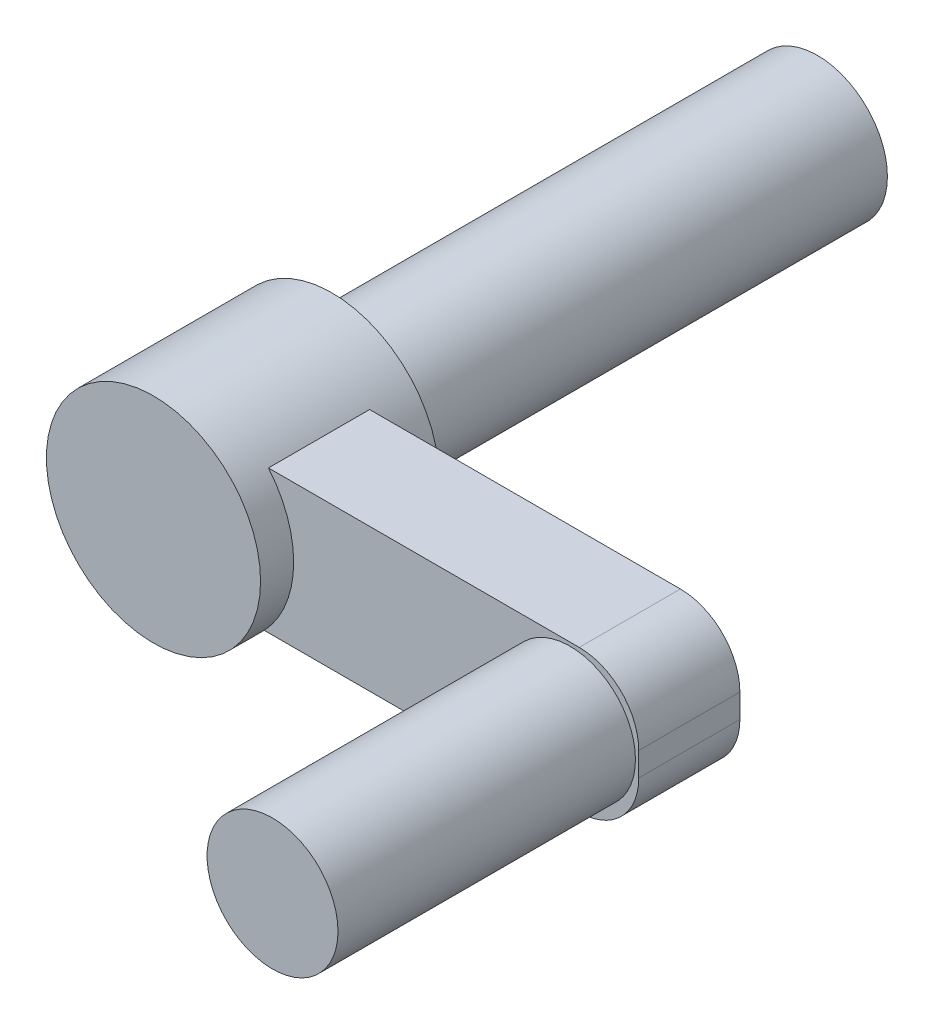
ISO-10303-21;
HEADER;
FILE_DESCRIPTION(('STEP AP214'),'2;1');
FILE_NAME('part.step','',(''),(''),'','','');
FILE_SCHEMA(('AUTOMOTIVE_DESIGN { 1 0 10303 214 1 1 1 1 }'));
ENDSEC;
DATA;
#1=APPLICATION_CONTEXT('core data for automotive mechanical design processes');
#2=APPLICATION_PROTOCOL_DEFINITION('international standard','automotive_design',2000,#1);
#3=PRODUCT_CONTEXT('',#1,'mechanical');
#4=PRODUCT('Part','Part','',(#3));
#5=PRODUCT_RELATED_PRODUCT_CATEGORY('part','',(#4));
#6=PRODUCT_DEFINITION_FORMATION('','',#4);
#7=PRODUCT_DEFINITION_CONTEXT('part definition',#1,'design');
#8=PRODUCT_DEFINITION('design','',#6,#7);
#9=PRODUCT_DEFINITION_SHAPE('','',#8);
#10=(LENGTH_UNIT() NAMED_UNIT(*) SI_UNIT(.MILLI.,.METRE.));
#11=(NAMED_UNIT(*) PLANE_ANGLE_UNIT() SI_UNIT($,.RADIAN.));
#12=(NAMED_UNIT(*) SI_UNIT($,.STERADIAN.) SOLID_ANGLE_UNIT());
#13=UNCERTAINTY_MEASURE_WITH_UNIT(LENGTH_MEASURE(1.E-05),#10,'distance_accuracy_value','');
#14=(GEOMETRIC_REPRESENTATION_CONTEXT(3) GLOBAL_UNCERTAINTY_ASSIGNED_CONTEXT((#13)) GLOBAL_UNIT_ASSIGNED_CONTEXT((#10,
#11,#12)) REPRESENTATION_CONTEXT('',''));
#15=CARTESIAN_POINT('',(0.,0.,0.));
#16=DIRECTION('',(0.,0.,1.));
#17=DIRECTION('',(1.,0.,0.));
#18=AXIS2_PLACEMENT_3D('',#15,#16,#17);
#19=CARTESIAN_POINT('',(33.,-1.1976283958276,53.0178686877295));
#20=DIRECTION('',(0.,0.,1.));
#21=DIRECTION('',(0.,-1.,0.));
#22=AXIS2_PLACEMENT_3D('',#19,#20,#21);
#23=CYLINDRICAL_SURFACE('',#22,5.);
#24=DIRECTION('',(0.,0.,1.));
#25=VECTOR('',#24,1.);
#26=CARTESIAN_POINT('',(33.,-6.1976283958276,53.0178686877295));
#27=LINE('',#26,#25);
#28=CARTESIAN_POINT('',(33.,-6.1976283958276,44.5178686877295));
#29=VERTEX_POINT('',#28);
#30=CARTESIAN_POINT('',(33.,-6.1976283958276,53.0178686877295));
#31=VERTEX_POINT('',#30);
#32=EDGE_CURVE('E123',#29,#31,#27,.T.);
#33=ORIENTED_EDGE('',*,*,#32,.F.);
#34=CARTESIAN_POINT('',(33.,-1.1976283958276,44.5178686877295));
#35=DIRECTION('',(0.,0.,1.));
#36=DIRECTION('',(1.,0.,0.));
#37=AXIS2_PLACEMENT_3D('',#34,#35,#36);
#38=CIRCLE('',#37,5.);
#39=CARTESIAN_POINT('',(38.,-1.1976283958276,44.5178686877295));
#40=VERTEX_POINT('',#39);
#41=EDGE_CURVE('E41',#40,#29,#38,.F.);
#42=ORIENTED_EDGE('',*,*,#41,.F.);
#43=DIRECTION('',(0.,0.,1.));
#44=VECTOR('',#43,1.);
#45=CARTESIAN_POINT('',(38.,-1.1976283958276,0.));
#46=LINE('',#45,#44);
#47=CARTESIAN_POINT('',(38.,-1.1976283958276,53.0178686877295));
#48=VERTEX_POINT('',#47);
#49=EDGE_CURVE('E126',#48,#40,#46,.F.);
#50=ORIENTED_EDGE('',*,*,#49,.F.);
#51=CARTESIAN_POINT('',(33.,-1.1976283958276,53.0178686877295));
#52=DIRECTION('',(0.,0.,1.));
#53=DIRECTION('',(1.,0.,0.));
#54=AXIS2_PLACEMENT_3D('',#51,#52,#53);
#55=CIRCLE('',#54,5.);
#56=EDGE_CURVE('E11',#31,#48,#55,.T.);
#57=ORIENTED_EDGE('',*,*,#56,.F.);
#58=EDGE_LOOP('',(#33,#42,#50,#57));
#59=FACE_BOUND('',#58,.T.);
#60=ADVANCED_FACE('F34',(#59),#23,.T.);
#61=CARTESIAN_POINT('',(33.,0.802371604172398,0.));
#62=DIRECTION('',(0.,0.,-1.));
#63=DIRECTION('',(-1.,0.,0.));
#64=AXIS2_PLACEMENT_3D('',#61,#62,#63);
#65=CYLINDRICAL_SURFACE('',#64,5.);
#66=DIRECTION('',(0.,0.,1.));
#67=VECTOR('',#66,1.);
#68=CARTESIAN_POINT('',(38.,0.802371604172398,0.));
#69=LINE('',#68,#67);
#70=CARTESIAN_POINT('',(38.,0.802371604172398,44.5178686877295));
#71=VERTEX_POINT('',#70);
#72=CARTESIAN_POINT('',(38.,0.802371604172398,53.0178686877295));
#73=VERTEX_POINT('',#72);
#74=EDGE_CURVE('E110',#71,#73,#69,.T.);
#75=ORIENTED_EDGE('',*,*,#74,.F.);
#76=CARTESIAN_POINT('',(33.,0.802371604172398,44.5178686877295));
#77=DIRECTION('',(0.,0.,1.));
#78=DIRECTION('',(1.,0.,0.));
#79=AXIS2_PLACEMENT_3D('',#76,#77,#78);
#80=CIRCLE('',#79,5.);
#81=CARTESIAN_POINT('',(33.,5.8023716041724,44.5178686877295));
#82=VERTEX_POINT('',#81);
#83=EDGE_CURVE('E119',#82,#71,#80,.F.);
#84=ORIENTED_EDGE('',*,*,#83,.F.);
#85=DIRECTION('',(0.,0.,1.));
#86=VECTOR('',#85,1.);
#87=CARTESIAN_POINT('',(33.,5.8023716041724,0.));
#88=LINE('',#87,#86);
#89=CARTESIAN_POINT('',(33.,5.8023716041724,53.0178686877295));
#90=VERTEX_POINT('',#89);
#91=EDGE_CURVE('E113',#90,#82,#88,.F.);
#92=ORIENTED_EDGE('',*,*,#91,.F.);
#93=CARTESIAN_POINT('',(33.,0.802371604172398,53.0178686877295));
#94=DIRECTION('',(0.,0.,1.));
#95=DIRECTION('',(1.,0.,0.));
#96=AXIS2_PLACEMENT_3D('',#93,#94,#95);
#97=CIRCLE('',#96,5.);
#98=EDGE_CURVE('E89',#73,#90,#97,.T.);
#99=ORIENTED_EDGE('',*,*,#98,.F.);
#100=EDGE_LOOP('',(#75,#84,#92,#99));
#101=FACE_BOUND('',#100,.T.);
#102=ADVANCED_FACE('F158',(#101),#65,.T.);
#103=CARTESIAN_POINT('',(0.,0.,40.8));
#104=DIRECTION('',(0.,0.,-1.));
#105=DIRECTION('',(-1.,0.,0.));
#106=AXIS2_PLACEMENT_3D('',#103,#104,#105);
#107=CYLINDRICAL_SURFACE('',#106,5.88);
#108=CARTESIAN_POINT('',(0.,0.,40.8));
#109=DIRECTION('',(0.,0.,1.));
#110=DIRECTION('',(1.,0.,0.));
#111=AXIS2_PLACEMENT_3D('',#108,#109,#110);
#112=CIRCLE('',#111,5.88);
#113=CARTESIAN_POINT('',(5.88,0.,40.8));
#114=VERTEX_POINT('',#113);
#115=EDGE_CURVE('E104',#114,#114,#112,.T.);
#116=ORIENTED_EDGE('',*,*,#115,.F.);
#117=EDGE_LOOP('',(#116));
#118=FACE_BOUND('',#117,.T.);
#119=CARTESIAN_POINT('',(0.,0.,0.));
#120=DIRECTION('',(0.,0.,1.));
#121=DIRECTION('',(1.,0.,0.));
#122=AXIS2_PLACEMENT_3D('',#119,#120,#121);
#123=CIRCLE('',#122,5.88);
#124=CARTESIAN_POINT('',(5.88,0.,0.));
#125=VERTEX_POINT('',#124);
#126=EDGE_CURVE('E150',#125,#125,#123,.T.);
#127=ORIENTED_EDGE('',*,*,#126,.T.);
#128=EDGE_LOOP('',(#127));
#129=FACE_BOUND('',#128,.T.);
#130=ADVANCED_FACE('F193',(#118,#129),#107,.T.);
#131=CARTESIAN_POINT('',(0.,0.,0.));
#132=DIRECTION('',(0.,0.,1.));
#133=DIRECTION('',(1.,0.,0.));
#134=AXIS2_PLACEMENT_3D('',#131,#132,#133);
#135=PLANE('',#134);
#136=CARTESIAN_POINT('',(0.,0.,0.));
#137=DIRECTION('',(0.,0.,-1.));
#138=DIRECTION('',(-1.,0.,0.));
#139=AXIS2_PLACEMENT_3D('',#136,#137,#138);
#140=CIRCLE('',#139,5.);
#141=CARTESIAN_POINT('',(-5.,0.,0.));
#142=VERTEX_POINT('',#141);
#143=EDGE_CURVE('E136',#142,#142,#140,.T.);
#144=ORIENTED_EDGE('',*,*,#143,.F.);
#145=EDGE_LOOP('',(#144));
#146=FACE_BOUND('',#145,.T.);
#147=ORIENTED_EDGE('',*,*,#126,.F.);
#148=EDGE_LOOP('',(#147));
#149=FACE_BOUND('',#148,.T.);
#150=ADVANCED_FACE('F197',(#146,#149),#135,.F.);
#151=CARTESIAN_POINT('',(0.,0.,55.8));
#152=DIRECTION('',(0.,0.,-1.));
#153=DIRECTION('',(-1.,0.,0.));
#154=AXIS2_PLACEMENT_3D('',#151,#152,#153);
#155=CYLINDRICAL_SURFACE('',#154,9.);
#156=DIRECTION('',(0.,0.,-1.));
#157=VECTOR('',#156,1.);
#158=CARTESIAN_POINT('',(6.52605564389635,-6.1976283958276,55.8));
#159=LINE('',#158,#157);
#160=CARTESIAN_POINT('',(6.52605564389635,-6.1976283958276,53.0178686877295));
#161=VERTEX_POINT('',#160);
#162=CARTESIAN_POINT('',(6.52605564389635,-6.1976283958276,44.5178686877295));
#163=VERTEX_POINT('',#162);
#164=EDGE_CURVE('E109',#161,#163,#159,.T.);
#165=ORIENTED_EDGE('',*,*,#164,.F.);
#166=CARTESIAN_POINT('',(0.,0.,53.0178686877295));
#167=DIRECTION('',(0.,0.,1.));
#168=DIRECTION('',(1.,0.,0.));
#169=AXIS2_PLACEMENT_3D('',#166,#167,#168);
#170=CIRCLE('',#169,9.);
#171=CARTESIAN_POINT('',(6.87986073747818,5.8023716041724,53.0178686877295));
#172=VERTEX_POINT('',#171);
#173=EDGE_CURVE('E86',#161,#172,#170,.T.);
#174=ORIENTED_EDGE('',*,*,#173,.T.);
#175=DIRECTION('',(0.,0.,-1.));
#176=VECTOR('',#175,1.);
#177=CARTESIAN_POINT('',(6.87986073747818,5.8023716041724,55.8));
#178=LINE('',#177,#176);
#179=CARTESIAN_POINT('',(6.87986073747818,5.8023716041724,44.5178686877295));
#180=VERTEX_POINT('',#179);
#181=EDGE_CURVE('E97',#172,#180,#178,.T.);
#182=ORIENTED_EDGE('',*,*,#181,.T.);
#183=CARTESIAN_POINT('',(0.,0.,44.5178686877295));
#184=DIRECTION('',(0.,0.,1.));
#185=DIRECTION('',(1.,0.,0.));
#186=AXIS2_PLACEMENT_3D('',#183,#184,#185);
#187=CIRCLE('',#186,9.);
#188=EDGE_CURVE('E103',#163,#180,#187,.T.);
#189=ORIENTED_EDGE('',*,*,#188,.F.);
#190=EDGE_LOOP('',(#165,#174,#182,#189));
#191=FACE_BOUND('',#190,.T.);
#192=CARTESIAN_POINT('',(0.,0.,55.8));
#193=DIRECTION('',(0.,0.,1.));
#194=DIRECTION('',(1.,0.,0.));
#195=AXIS2_PLACEMENT_3D('',#192,#193,#194);
#196=CIRCLE('',#195,9.);
#197=CARTESIAN_POINT('',(9.,0.,55.8));
#198=VERTEX_POINT('',#197);
#199=EDGE_CURVE('E147',#198,#198,#196,.T.);
#200=ORIENTED_EDGE('',*,*,#199,.F.);
#201=EDGE_LOOP('',(#200));
#202=FACE_BOUND('',#201,.T.);
#203=CARTESIAN_POINT('',(0.,0.,40.8));
#204=DIRECTION('',(0.,0.,1.));
#205=DIRECTION('',(1.,0.,0.));
#206=AXIS2_PLACEMENT_3D('',#203,#204,#205);
#207=CIRCLE('',#206,9.);
#208=CARTESIAN_POINT('',(9.,0.,40.8));
#209=VERTEX_POINT('',#208);
#210=EDGE_CURVE('E144',#209,#209,#207,.T.);
#211=ORIENTED_EDGE('',*,*,#210,.T.);
#212=EDGE_LOOP('',(#211));
#213=FACE_BOUND('',#212,.T.);
#214=ADVANCED_FACE('F106',(#191,#202,#213),#155,.T.);
#215=CARTESIAN_POINT('',(0.,0.,55.8));
#216=DIRECTION('',(0.,0.,1.));
#217=DIRECTION('',(1.,0.,0.));
#218=AXIS2_PLACEMENT_3D('',#215,#216,#217);
#219=PLANE('',#218);
#220=ORIENTED_EDGE('',*,*,#199,.T.);
#221=EDGE_LOOP('',(#220));
#222=FACE_BOUND('',#221,.T.);
#223=ADVANCED_FACE('F206',(#222),#219,.T.);
#224=CARTESIAN_POINT('',(0.,0.,40.8));
#225=DIRECTION('',(0.,0.,1.));
#226=DIRECTION('',(1.,0.,0.));
#227=AXIS2_PLACEMENT_3D('',#224,#225,#226);
#228=PLANE('',#227);
#229=ORIENTED_EDGE('',*,*,#115,.T.);
#230=EDGE_LOOP('',(#229));
#231=FACE_BOUND('',#230,.T.);
#232=ORIENTED_EDGE('',*,*,#210,.F.);
#233=EDGE_LOOP('',(#232));
#234=FACE_BOUND('',#233,.T.);
#235=ADVANCED_FACE('F207',(#231,#234),#228,.F.);
#236=CARTESIAN_POINT('',(0.,0.,40.));
#237=DIRECTION('',(0.,0.,-1.));
#238=DIRECTION('',(-1.,0.,0.));
#239=AXIS2_PLACEMENT_3D('',#236,#237,#238);
#240=CYLINDRICAL_SURFACE('',#239,5.);
#241=CARTESIAN_POINT('',(0.,0.,40.));
#242=DIRECTION('',(0.,0.,-1.));
#243=DIRECTION('',(-1.,0.,0.));
#244=AXIS2_PLACEMENT_3D('',#241,#242,#243);
#245=CIRCLE('',#244,5.);
#246=CARTESIAN_POINT('',(-5.,0.,40.));
#247=VERTEX_POINT('',#246);
#248=EDGE_CURVE('E141',#247,#247,#245,.T.);
#249=ORIENTED_EDGE('',*,*,#248,.F.);
#250=EDGE_LOOP('',(#249));
#251=FACE_BOUND('',#250,.T.);
#252=ORIENTED_EDGE('',*,*,#143,.T.);
#253=EDGE_LOOP('',(#252));
#254=FACE_BOUND('',#253,.T.);
#255=ADVANCED_FACE('F210',(#251,#254),#240,.F.);
#256=CARTESIAN_POINT('',(0.,0.,40.));
#257=DIRECTION('',(0.,0.,-1.));
#258=DIRECTION('',(-1.,0.,0.));
#259=AXIS2_PLACEMENT_3D('',#256,#257,#258);
#260=PLANE('',#259);
#261=ORIENTED_EDGE('',*,*,#248,.T.);
#262=EDGE_LOOP('',(#261));
#263=FACE_BOUND('',#262,.T.);
#264=ADVANCED_FACE('F216',(#263),#260,.T.);
#265=CARTESIAN_POINT('',(38.,-6.1976283958276,53.0178686877295));
#266=DIRECTION('',(0.,1.,0.));
#267=DIRECTION('',(0.,0.,1.));
#268=AXIS2_PLACEMENT_3D('',#265,#266,#267);
#269=PLANE('',#268);
#270=DIRECTION('',(-1.,0.,0.));
#271=VECTOR('',#270,1.);
#272=CARTESIAN_POINT('',(38.,-6.1976283958276,44.5178686877295));
#273=LINE('',#272,#271);
#274=EDGE_CURVE('E131',#29,#163,#273,.T.);
#275=ORIENTED_EDGE('',*,*,#274,.F.);
#276=ORIENTED_EDGE('',*,*,#32,.T.);
#277=DIRECTION('',(-1.,0.,0.));
#278=VECTOR('',#277,1.);
#279=CARTESIAN_POINT('',(38.,-6.1976283958276,53.0178686877295));
#280=LINE('',#279,#278);
#281=EDGE_CURVE('E134',#31,#161,#280,.T.);
#282=ORIENTED_EDGE('',*,*,#281,.T.);
#283=ORIENTED_EDGE('',*,*,#164,.T.);
#284=EDGE_LOOP('',(#275,#276,#282,#283));
#285=FACE_BOUND('',#284,.T.);
#286=ADVANCED_FACE('F133',(#285),#269,.F.);
#287=CARTESIAN_POINT('',(38.,5.8023716041724,53.0178686877295));
#288=DIRECTION('',(0.,1.,0.));
#289=DIRECTION('',(0.,0.,1.));
#290=AXIS2_PLACEMENT_3D('',#287,#288,#289);
#291=PLANE('',#290);
#292=DIRECTION('',(-1.,0.,0.));
#293=VECTOR('',#292,1.);
#294=CARTESIAN_POINT('',(38.,5.8023716041724,53.0178686877295));
#295=LINE('',#294,#293);
#296=EDGE_CURVE('E82',#90,#172,#295,.T.);
#297=ORIENTED_EDGE('',*,*,#296,.F.);
#298=ORIENTED_EDGE('',*,*,#91,.T.);
#299=DIRECTION('',(-1.,0.,0.));
#300=VECTOR('',#299,1.);
#301=CARTESIAN_POINT('',(38.,5.8023716041724,44.5178686877295));
#302=LINE('',#301,#300);
#303=EDGE_CURVE('E93',#82,#180,#302,.T.);
#304=ORIENTED_EDGE('',*,*,#303,.T.);
#305=ORIENTED_EDGE('',*,*,#181,.F.);
#306=EDGE_LOOP('',(#297,#298,#304,#305));
#307=FACE_BOUND('',#306,.T.);
#308=ADVANCED_FACE('F98',(#307),#291,.T.);
#309=CARTESIAN_POINT('',(38.,-6.1976283958276,53.0178686877295));
#310=DIRECTION('',(0.,0.,1.));
#311=DIRECTION('',(1.,0.,0.));
#312=AXIS2_PLACEMENT_3D('',#309,#310,#311);
#313=PLANE('',#312);
#314=CARTESIAN_POINT('',(32.2226849826279,0.,53.0178686877295));
#315=DIRECTION('',(0.,0.,1.));
#316=DIRECTION('',(1.,0.,0.));
#317=AXIS2_PLACEMENT_3D('',#314,#315,#316);
#318=CIRCLE('',#317,5.5);
#319=CARTESIAN_POINT('',(37.7226849826279,0.,53.0178686877295));
#320=VERTEX_POINT('',#319);
#321=EDGE_CURVE('E166',#320,#320,#318,.T.);
#322=ORIENTED_EDGE('',*,*,#321,.F.);
#323=EDGE_LOOP('',(#322));
#324=FACE_BOUND('',#323,.T.);
#325=ORIENTED_EDGE('',*,*,#281,.F.);
#326=ORIENTED_EDGE('',*,*,#56,.T.);
#327=DIRECTION('',(0.,1.,0.));
#328=VECTOR('',#327,1.);
#329=CARTESIAN_POINT('',(38.,-6.1976283958276,53.0178686877295));
#330=LINE('',#329,#328);
#331=EDGE_CURVE('E162',#48,#73,#330,.T.);
#332=ORIENTED_EDGE('',*,*,#331,.T.);
#333=ORIENTED_EDGE('',*,*,#98,.T.);
#334=ORIENTED_EDGE('',*,*,#296,.T.);
#335=ORIENTED_EDGE('',*,*,#173,.F.);
#336=EDGE_LOOP('',(#325,#326,#332,#333,#334,#335));
#337=FACE_BOUND('',#336,.T.);
#338=ADVANCED_FACE('F84',(#324,#337),#313,.T.);
#339=CARTESIAN_POINT('',(38.,-6.1976283958276,44.5178686877295));
#340=DIRECTION('',(0.,0.,1.));
#341=DIRECTION('',(1.,0.,0.));
#342=AXIS2_PLACEMENT_3D('',#339,#340,#341);
#343=PLANE('',#342);
#344=DIRECTION('',(0.,1.,0.));
#345=VECTOR('',#344,1.);
#346=CARTESIAN_POINT('',(38.,-6.1976283958276,44.5178686877295));
#347=LINE('',#346,#345);
#348=EDGE_CURVE('E94',#40,#71,#347,.T.);
#349=ORIENTED_EDGE('',*,*,#348,.F.);
#350=ORIENTED_EDGE('',*,*,#41,.T.);
#351=ORIENTED_EDGE('',*,*,#274,.T.);
#352=ORIENTED_EDGE('',*,*,#188,.T.);
#353=ORIENTED_EDGE('',*,*,#303,.F.);
#354=ORIENTED_EDGE('',*,*,#83,.T.);
#355=EDGE_LOOP('',(#349,#350,#351,#352,#353,#354));
#356=FACE_BOUND('',#355,.T.);
#357=ADVANCED_FACE('F129',(#356),#343,.F.);
#358=CARTESIAN_POINT('',(38.,0.,0.));
#359=DIRECTION('',(-1.,0.,0.));
#360=DIRECTION('',(0.,0.,1.));
#361=AXIS2_PLACEMENT_3D('',#358,#359,#360);
#362=PLANE('',#361);
#363=ORIENTED_EDGE('',*,*,#331,.F.);
#364=ORIENTED_EDGE('',*,*,#49,.T.);
#365=ORIENTED_EDGE('',*,*,#348,.T.);
#366=ORIENTED_EDGE('',*,*,#74,.T.);
#367=EDGE_LOOP('',(#363,#364,#365,#366));
#368=FACE_BOUND('',#367,.T.);
#369=ADVANCED_FACE('F161',(#368),#362,.F.);
#370=CARTESIAN_POINT('',(32.2226849826279,0.,78.0178686877296));
#371=DIRECTION('',(0.,0.,-1.));
#372=DIRECTION('',(-1.,0.,0.));
#373=AXIS2_PLACEMENT_3D('',#370,#371,#372);
#374=CYLINDRICAL_SURFACE('',#373,5.5);
#375=CARTESIAN_POINT('',(32.2226849826279,0.,78.0178686877296));
#376=DIRECTION('',(0.,0.,1.));
#377=DIRECTION('',(1.,0.,0.));
#378=AXIS2_PLACEMENT_3D('',#375,#376,#377);
#379=CIRCLE('',#378,5.5);
#380=CARTESIAN_POINT('',(37.7226849826279,0.,78.0178686877296));
#381=VERTEX_POINT('',#380);
#382=EDGE_CURVE('E163',#381,#381,#379,.T.);
#383=ORIENTED_EDGE('',*,*,#382,.F.);
#384=EDGE_LOOP('',(#383));
#385=FACE_BOUND('',#384,.T.);
#386=ORIENTED_EDGE('',*,*,#321,.T.);
#387=EDGE_LOOP('',(#386));
#388=FACE_BOUND('',#387,.T.);
#389=ADVANCED_FACE('F174',(#385,#388),#374,.T.);
#390=CARTESIAN_POINT('',(32.2226849826279,0.,78.0178686877296));
#391=DIRECTION('',(0.,0.,1.));
#392=DIRECTION('',(1.,0.,0.));
#393=AXIS2_PLACEMENT_3D('',#390,#391,#392);
#394=PLANE('',#393);
#395=ORIENTED_EDGE('',*,*,#382,.T.);
#396=EDGE_LOOP('',(#395));
#397=FACE_BOUND('',#396,.T.);
#398=ADVANCED_FACE('F172',(#397),#394,.T.);
#399=CLOSED_SHELL('',(#60,#102,#130,#150,#214,#223,#235,#255,#264,#286,#308,#338,#357,#369,#389,#398));
#400=MANIFOLD_SOLID_BREP('B2',#399);
#401=ADVANCED_BREP_SHAPE_REPRESENTATION('',(#18,#400),#14);
#402=SHAPE_DEFINITION_REPRESENTATION(#9,#401);
ENDSEC;
END-ISO-10303-21;
